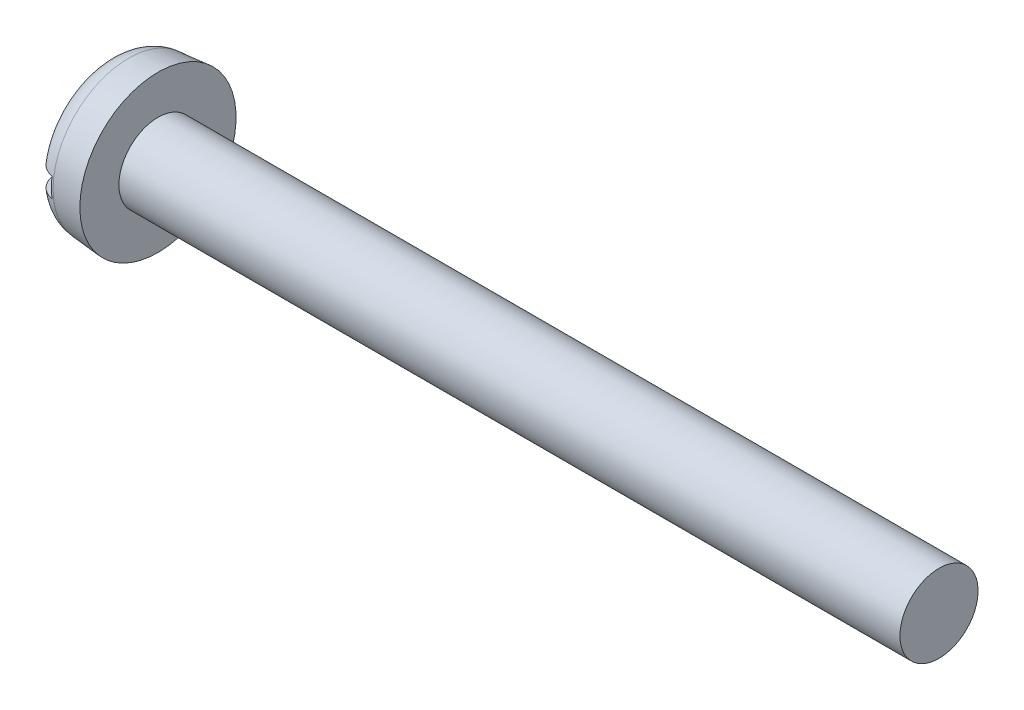
ISO-10303-21;
HEADER;
FILE_DESCRIPTION(('STEP AP214'),'2;1');
FILE_NAME('part.step','',(''),(''),'','','');
FILE_SCHEMA(('AUTOMOTIVE_DESIGN { 1 0 10303 214 1 1 1 1 }'));
ENDSEC;
DATA;
#1=APPLICATION_CONTEXT('core data for automotive mechanical design processes');
#2=APPLICATION_PROTOCOL_DEFINITION('international standard','automotive_design',2000,#1);
#3=PRODUCT_CONTEXT('',#1,'mechanical');
#4=PRODUCT('Part','Part','',(#3));
#5=PRODUCT_RELATED_PRODUCT_CATEGORY('part','',(#4));
#6=PRODUCT_DEFINITION_FORMATION('','',#4);
#7=PRODUCT_DEFINITION_CONTEXT('part definition',#1,'design');
#8=PRODUCT_DEFINITION('design','',#6,#7);
#9=PRODUCT_DEFINITION_SHAPE('','',#8);
#10=(LENGTH_UNIT() NAMED_UNIT(*) SI_UNIT(.MILLI.,.METRE.));
#11=(NAMED_UNIT(*) PLANE_ANGLE_UNIT() SI_UNIT($,.RADIAN.));
#12=(NAMED_UNIT(*) SI_UNIT($,.STERADIAN.) SOLID_ANGLE_UNIT());
#13=UNCERTAINTY_MEASURE_WITH_UNIT(LENGTH_MEASURE(1.E-05),#10,'distance_accuracy_value','');
#14=(GEOMETRIC_REPRESENTATION_CONTEXT(3) GLOBAL_UNCERTAINTY_ASSIGNED_CONTEXT((#13)) GLOBAL_UNIT_ASSIGNED_CONTEXT((#10,
#11,#12)) REPRESENTATION_CONTEXT('',''));
#15=CARTESIAN_POINT('',(0.,0.,0.));
#16=DIRECTION('',(0.,0.,1.));
#17=DIRECTION('',(1.,0.,0.));
#18=AXIS2_PLACEMENT_3D('',#15,#16,#17);
#19=CARTESIAN_POINT('',(0.,0.,0.));
#20=DIRECTION('',(-1.,0.,0.));
#21=DIRECTION('',(0.,0.,1.));
#22=AXIS2_PLACEMENT_3D('',#19,#20,#21);
#23=PLANE('',#22);
#24=DIRECTION('',(0.,0.,-1.));
#25=VECTOR('',#24,1.);
#26=CARTESIAN_POINT('',(0.,0.25,2.));
#27=LINE('',#26,#25);
#28=CARTESIAN_POINT('',(0.,0.25,1.3128752634498));
#29=VERTEX_POINT('',#28);
#30=CARTESIAN_POINT('',(0.,0.25,-1.3128752634498));
#31=VERTEX_POINT('',#30);
#32=EDGE_CURVE('E87',#29,#31,#27,.T.);
#33=ORIENTED_EDGE('',*,*,#32,.F.);
#34=CARTESIAN_POINT('',(0.,0.,0.));
#35=DIRECTION('',(-1.,0.,0.));
#36=DIRECTION('',(0.,0.,1.));
#37=AXIS2_PLACEMENT_3D('',#34,#35,#36);
#38=CIRCLE('',#37,1.33646603300584);
#39=EDGE_CURVE('E93',#29,#31,#38,.T.);
#40=ORIENTED_EDGE('',*,*,#39,.T.);
#41=EDGE_LOOP('',(#33,#40));
#42=FACE_BOUND('',#41,.T.);
#43=ADVANCED_FACE('F34',(#42),#23,.T.);
#44=CARTESIAN_POINT('',(-25.4,0.,0.));
#45=DIRECTION('',(-1.,0.,0.));
#46=DIRECTION('',(0.,0.,1.));
#47=AXIS2_PLACEMENT_3D('',#44,#45,#46);
#48=CYLINDRICAL_SURFACE('',#47,1.);
#49=CARTESIAN_POINT('',(21.3,0.,0.));
#50=DIRECTION('',(-1.,0.,0.));
#51=DIRECTION('',(0.,0.,1.));
#52=AXIS2_PLACEMENT_3D('',#49,#50,#51);
#53=CIRCLE('',#52,1.);
#54=CARTESIAN_POINT('',(21.3,0.,1.));
#55=VERTEX_POINT('',#54);
#56=EDGE_CURVE('E94',#55,#55,#53,.T.);
#57=ORIENTED_EDGE('',*,*,#56,.T.);
#58=EDGE_LOOP('',(#57));
#59=FACE_BOUND('',#58,.T.);
#60=CARTESIAN_POINT('',(1.3,0.,0.));
#61=DIRECTION('',(-1.,0.,0.));
#62=DIRECTION('',(0.,0.,1.));
#63=AXIS2_PLACEMENT_3D('',#60,#61,#62);
#64=CIRCLE('',#63,1.);
#65=CARTESIAN_POINT('',(1.3,0.,1.));
#66=VERTEX_POINT('',#65);
#67=EDGE_CURVE('E151',#66,#66,#64,.T.);
#68=ORIENTED_EDGE('',*,*,#67,.F.);
#69=EDGE_LOOP('',(#68));
#70=FACE_BOUND('',#69,.T.);
#71=ADVANCED_FACE('F139',(#59,#70),#48,.T.);
#72=CARTESIAN_POINT('',(21.3,1.,0.));
#73=DIRECTION('',(1.,0.,0.));
#74=DIRECTION('',(0.,0.,-1.));
#75=AXIS2_PLACEMENT_3D('',#72,#73,#74);
#76=PLANE('',#75);
#77=ORIENTED_EDGE('',*,*,#56,.F.);
#78=EDGE_LOOP('',(#77));
#79=FACE_BOUND('',#78,.T.);
#80=ADVANCED_FACE('F137',(#79),#76,.T.);
#81=DIRECTION('',(0.,0.,1.));
#82=VECTOR('',#81,1.);
#83=CARTESIAN_POINT('',(0.,-0.25,-2.));
#84=LINE('',#83,#82);
#85=CARTESIAN_POINT('',(0.,-0.25,-1.3128752634498));
#86=VERTEX_POINT('',#85);
#87=CARTESIAN_POINT('',(0.,-0.25,1.3128752634498));
#88=VERTEX_POINT('',#87);
#89=EDGE_CURVE('E78',#86,#88,#84,.T.);
#90=ORIENTED_EDGE('',*,*,#89,.F.);
#91=EDGE_CURVE('E85',#86,#88,#38,.T.);
#92=ORIENTED_EDGE('',*,*,#91,.T.);
#93=EDGE_LOOP('',(#90,#92));
#94=FACE_BOUND('',#93,.T.);
#95=ADVANCED_FACE('F84',(#94),#23,.T.);
#96=CARTESIAN_POINT('',(0.,0.,0.));
#97=DIRECTION('',(1.,0.,0.));
#98=DIRECTION('',(0.,0.,-1.));
#99=AXIS2_PLACEMENT_3D('',#96,#97,#98);
#100=CONICAL_SURFACE('',#99,1.8862647374163,0.0872664625997168);
#101=CARTESIAN_POINT('',(0.547706554351407,0.,0.));
#102=DIRECTION('',(-1.,0.,0.));
#103=DIRECTION('',(0.,0.,1.));
#104=AXIS2_PLACEMENT_3D('',#101,#102,#103);
#105=CIRCLE('',#104,1.93418285186089);
#106=CARTESIAN_POINT('',(0.547706554351407,0.,1.93418285186089));
#107=VERTEX_POINT('',#106);
#108=EDGE_CURVE('E97',#107,#107,#105,.F.);
#109=ORIENTED_EDGE('',*,*,#108,.T.);
#110=EDGE_LOOP('',(#109));
#111=FACE_BOUND('',#110,.T.);
#112=CARTESIAN_POINT('',(1.3,0.,0.));
#113=DIRECTION('',(-1.,0.,0.));
#114=DIRECTION('',(0.,0.,1.));
#115=AXIS2_PLACEMENT_3D('',#112,#113,#114);
#116=CIRCLE('',#115,2.);
#117=CARTESIAN_POINT('',(1.3,0.,2.));
#118=VERTEX_POINT('',#117);
#119=EDGE_CURVE('E99',#118,#118,#116,.T.);
#120=ORIENTED_EDGE('',*,*,#119,.T.);
#121=EDGE_LOOP('',(#120));
#122=FACE_BOUND('',#121,.T.);
#123=ADVANCED_FACE('F130',(#111,#122),#100,.T.);
#124=CARTESIAN_POINT('',(1.3,1.,0.));
#125=DIRECTION('',(-1.,0.,0.));
#126=DIRECTION('',(0.,0.,1.));
#127=AXIS2_PLACEMENT_3D('',#124,#125,#126);
#128=PLANE('',#127);
#129=ORIENTED_EDGE('',*,*,#119,.F.);
#130=EDGE_LOOP('',(#129));
#131=FACE_BOUND('',#130,.T.);
#132=ORIENTED_EDGE('',*,*,#67,.T.);
#133=EDGE_LOOP('',(#132));
#134=FACE_BOUND('',#133,.T.);
#135=ADVANCED_FACE('F126',(#131,#134),#128,.F.);
#136=CARTESIAN_POINT('',(0.6,0.,0.));
#137=DIRECTION('',(-1.,0.,0.));
#138=DIRECTION('',(0.,0.,1.));
#139=AXIS2_PLACEMENT_3D('',#136,#137,#138);
#140=TOROIDAL_SURFACE('',#139,1.33646603300584,0.6);
#141=CARTESIAN_POINT('',(0.274780655200361,0.25,-1.82362420667529));
#142=CARTESIAN_POINT('',(0.302850124065662,0.25,-1.84189666141675));
#143=CARTESIAN_POINT('',(0.332476912836235,0.25,-1.85782010480749));
#144=CARTESIAN_POINT('',(0.394006386294874,0.25,-1.8844828387307));
#145=CARTESIAN_POINT('',(0.425911622330593,0.25,-1.89521620967586));
#146=CARTESIAN_POINT('',(0.49106542171139,0.25,-1.91116335358415));
#147=CARTESIAN_POINT('',(0.524313546486278,0.25,-1.91637891370101));
#148=CARTESIAN_POINT('',(0.591204792683812,0.25,-1.92113959303415));
#149=CARTESIAN_POINT('',(0.624847818162146,0.25,-1.92068606223462));
#150=CARTESIAN_POINT('',(0.691513871966761,0.25,-1.91413229696864));
#151=CARTESIAN_POINT('',(0.724537965843794,0.25,-1.90804289638476));
#152=CARTESIAN_POINT('',(0.789097481854443,0.25,-1.89041111372299));
#153=CARTESIAN_POINT('',(0.820632856008674,0.25,-1.87886855602915));
#154=CARTESIAN_POINT('',(0.881355504744871,0.25,-1.85065407323916));
#155=CARTESIAN_POINT('',(0.910540461536868,0.25,-1.8339771613426));
#156=CARTESIAN_POINT('',(0.965713973197687,0.25,-1.7959832160475));
#157=CARTESIAN_POINT('',(0.991702483157432,0.25,-1.77466611746743));
#158=CARTESIAN_POINT('',(1.03989067692429,0.25,-1.72788939986325));
#159=CARTESIAN_POINT('',(1.06207077173726,0.25,-1.70240960587084));
#160=CARTESIAN_POINT('',(1.10188385808005,0.25,-1.64811708765422));
#161=CARTESIAN_POINT('',(1.11951669564412,0.25,-1.61930425062421));
#162=CARTESIAN_POINT('',(1.14991644324992,0.25,-1.55888388907361));
#163=CARTESIAN_POINT('',(1.16263701266532,0.25,-1.52725305653232));
#164=CARTESIAN_POINT('',(1.18266472006596,0.25,-1.46232290586992));
#165=CARTESIAN_POINT('',(1.18997153304379,0.25,-1.42902348770568));
#166=CARTESIAN_POINT('',(1.1990757467124,0.25,-1.36122512528321));
#167=CARTESIAN_POINT('',(1.2007978533932,0.25,-1.3267160782536));
#168=CARTESIAN_POINT('',(1.19852158611446,0.25,-1.25788795964169));
#169=CARTESIAN_POINT('',(1.19452272743365,0.25,-1.22356890440419));
#170=CARTESIAN_POINT('',(1.18084584012593,0.25,-1.15550299104831));
#171=CARTESIAN_POINT('',(1.1710768980116,0.25,-1.12177439719896));
#172=CARTESIAN_POINT('',(1.14608963326822,0.25,-1.05639845281472));
#173=CARTESIAN_POINT('',(1.13087072283895,0.25,-1.02475132721021));
#174=CARTESIAN_POINT('',(1.09517672424942,0.25,-0.964015185217591));
#175=CARTESIAN_POINT('',(1.07463585116154,0.25,-0.934964791126672));
#176=CARTESIAN_POINT('',(1.0289468611237,0.25,-0.880736843040393));
#177=CARTESIAN_POINT('',(1.00379831827947,0.25,-0.855559647447028));
#178=CARTESIAN_POINT('',(0.949690395648163,0.25,-0.809995267822458));
#179=CARTESIAN_POINT('',(0.920750663668051,0.25,-0.789584802369704));
#180=CARTESIAN_POINT('',(0.859743350231912,0.25,-0.754142685467499));
#181=CARTESIAN_POINT('',(0.827676707896818,0.25,-0.739109425347756));
#182=CARTESIAN_POINT('',(0.762667368563303,0.25,-0.715550940340569));
#183=CARTESIAN_POINT('',(0.729809776019389,0.25,-0.706791374099582));
#184=CARTESIAN_POINT('',(0.663065073704784,0.25,-0.695254567880968));
#185=CARTESIAN_POINT('',(0.629178416423444,0.25,-0.69247473610395));
#186=CARTESIAN_POINT('',(0.563211392329523,0.25,-0.693020234763517));
#187=CARTESIAN_POINT('',(0.531128042957495,0.25,-0.696037951412193));
#188=CARTESIAN_POINT('',(0.467930020079841,0.25,-0.707432616918485));
#189=CARTESIAN_POINT('',(0.436815388934093,0.25,-0.715809799789358));
#190=CARTESIAN_POINT('',(0.376446381647119,0.25,-0.737546549416802));
#191=CARTESIAN_POINT('',(0.347188974627552,0.25,-0.750897740765059));
#192=CARTESIAN_POINT('',(0.29118144985243,0.25,-0.782096393740082));
#193=CARTESIAN_POINT('',(0.264431855473699,0.25,-0.799944791073732));
#194=CARTESIAN_POINT('',(0.21280112205241,0.25,-0.840563479123866));
#195=CARTESIAN_POINT('',(0.18807630516109,0.25,-0.863532471122662));
#196=CARTESIAN_POINT('',(0.142632089074548,0.25,-0.913140155498345));
#197=CARTESIAN_POINT('',(0.121913544381091,0.25,-0.939779628685344));
#198=CARTESIAN_POINT('',(0.0841798141603359,0.25,-0.997238681509955));
#199=CARTESIAN_POINT('',(0.0673637911083437,0.25,-1.02818930073671));
#200=CARTESIAN_POINT('',(0.0390991703503447,0.25,-1.09245311591645));
#201=CARTESIAN_POINT('',(0.0276510234354346,0.25,-1.12576651002353));
#202=CARTESIAN_POINT('',(0.0103722361801808,0.25,-1.19421384118873));
#203=CARTESIAN_POINT('',(0.00460478662294662,0.25,-1.2293637757047));
#204=CARTESIAN_POINT('',(-0.000878679151094756,0.25,-1.30013265464533));
#205=CARTESIAN_POINT('',(-0.000595165424060245,0.25,-1.33575156242399));
#206=CARTESIAN_POINT('',(0.00602927957051808,0.25,-1.40603493785938));
#207=CARTESIAN_POINT('',(0.0123048116822737,0.25,-1.44070555722832));
#208=CARTESIAN_POINT('',(0.0306887868415261,0.25,-1.50847558350848));
#209=CARTESIAN_POINT('',(0.0427982176917193,0.25,-1.54157472329189));
#210=CARTESIAN_POINT('',(0.0722935157774218,0.25,-1.60468559872415));
#211=CARTESIAN_POINT('',(0.089592245738643,0.25,-1.63473812116026));
#212=CARTESIAN_POINT('',(0.129048154505429,0.25,-1.6914266708082));
#213=CARTESIAN_POINT('',(0.151198946684604,0.25,-1.71806711686356));
#214=CARTESIAN_POINT('',(0.190498702041562,0.25,-1.75782741941758));
#215=CARTESIAN_POINT('',(0.206359023192159,0.25,-1.77224346176931));
#216=CARTESIAN_POINT('',(0.23952762918078,0.25,-1.79930107726038));
#217=CARTESIAN_POINT('',(0.256835902453732,0.25,-1.81194266457048));
#218=CARTESIAN_POINT('',(0.274780655200361,0.25,-1.82362420667529));
#219=B_SPLINE_CURVE_WITH_KNOTS('',3,(#141,#142,#143,#144,#145,#146,#147,#148,#149,#150,#151,
#152,#153,#154,#155,#156,#157,#158,#159,#160,#161,#162,#163,#164,#165,#166,#167,#168,#169,#170,
#171,#172,#173,#174,#175,#176,#177,#178,#179,#180,#181,#182,#183,#184,#185,#186,#187,#188,#189,
#190,#191,#192,#193,#194,#195,#196,#197,#198,#199,#200,#201,#202,#203,#204,#205,#206,#207,#208,
#209,#210,#211,#212,#213,#214,#215,#216,#217,#218),.UNSPECIFIED.,.T.,.F.,(4,2,2,2,2,2,2,2,2,2,2,
2,2,2,2,2,2,2,2,2,2,2,2,2,2,2,2,2,2,2,2,2,2,2,2,2,2,2,4),(0.,0.100401062182578,
0.200916369230917,0.301399110583017,0.401857924372673,0.502124025494567,0.602393355851687,
0.70276038283154,0.80312881977564,0.903998978686786,1.00487255251616,1.10667574998262,
1.20848505856888,1.31166139334771,1.41484647048427,1.5197024094854,1.62456966101414,
1.73080076101002,1.83704168507411,1.94275232230141,2.04843130812937,2.14992147627128,
2.25136764660652,2.34757938832311,2.44379533127149,2.53984998938428,2.6359246495452,
2.73671855873459,2.83753394270023,2.9427139364961,3.04790276166498,3.1542488966228,
3.26058677033834,3.36577714242787,3.4709853317399,3.57451735589247,3.67791391414109,
3.74210061585798,3.8062868049523),.UNSPECIFIED.);
#220=CARTESIAN_POINT('',(0.5,0.25,-1.91179742470572));
#221=VERTEX_POINT('',#220);
#222=EDGE_CURVE('E11',#31,#221,#219,.T.);
#223=ORIENTED_EDGE('',*,*,#222,.F.);
#224=ORIENTED_EDGE('',*,*,#39,.F.);
#225=CARTESIAN_POINT('',(0.25647797126752,0.25,0.806687931408376));
#226=CARTESIAN_POINT('',(0.283073772587687,0.25,0.787245268924266));
#227=CARTESIAN_POINT('',(0.311256734673757,0.25,0.769944535846651));
#228=CARTESIAN_POINT('',(0.370114008258176,0.25,0.740229039319213));
#229=CARTESIAN_POINT('',(0.400789824440839,0.25,0.727817253657524));
#230=CARTESIAN_POINT('',(0.463871915221717,0.25,0.708374903085697));
#231=CARTESIAN_POINT('',(0.496281146765579,0.25,0.701353868838656));
#232=CARTESIAN_POINT('',(0.561820079529305,0.25,0.693064165401108));
#233=CARTESIAN_POINT('',(0.594949507008968,0.25,0.691793347727689));
#234=CARTESIAN_POINT('',(0.65986859958071,0.25,0.695008568960631));
#235=CARTESIAN_POINT('',(0.691667437306452,0.25,0.699313344775918));
#236=CARTESIAN_POINT('',(0.754098929301161,0.25,0.713169938820386));
#237=CARTESIAN_POINT('',(0.784731434429555,0.25,0.722722425688242));
#238=CARTESIAN_POINT('',(0.844220886452172,0.25,0.746760750983483));
#239=CARTESIAN_POINT('',(0.873064893626733,0.25,0.761278483323786));
#240=CARTESIAN_POINT('',(0.928072070248523,0.25,0.794719206207592));
#241=CARTESIAN_POINT('',(0.954234673131182,0.25,0.813643124999441));
#242=CARTESIAN_POINT('',(1.00455764012357,0.25,0.856403426025716));
#243=CARTESIAN_POINT('',(1.02854601727969,0.25,0.880442281861904));
#244=CARTESIAN_POINT('',(1.07233969055911,0.25,0.93206911063745));
#245=CARTESIAN_POINT('',(1.09214414470062,0.25,0.959657796158255));
#246=CARTESIAN_POINT('',(1.1277806057224,0.25,1.01880991735135));
#247=CARTESIAN_POINT('',(1.14342273788476,0.25,1.05048797462787));
#248=CARTESIAN_POINT('',(1.16921417457241,0.25,1.11600811372881));
#249=CARTESIAN_POINT('',(1.17936312023956,0.25,1.14985033677212));
#250=CARTESIAN_POINT('',(1.19390640883483,0.25,1.21901855241697));
#251=CARTESIAN_POINT('',(1.198256990977,0.25,1.25435377468586));
#252=CARTESIAN_POINT('',(1.20088701701162,0.25,1.32525082928571));
#253=CARTESIAN_POINT('',(1.19916675302153,0.25,1.36081265063096));
#254=CARTESIAN_POINT('',(1.18971168250471,0.25,1.43069187166979));
#255=CARTESIAN_POINT('',(1.18204966947663,0.25,1.46501910735442));
#256=CARTESIAN_POINT('',(1.16097413489613,0.25,1.53186104297244));
#257=CARTESIAN_POINT('',(1.14756110125118,0.25,1.5643758964011));
#258=CARTESIAN_POINT('',(1.11560510746244,0.25,1.62610187095566));
#259=CARTESIAN_POINT('',(1.097149951566,0.25,1.65535845455428));
#260=CARTESIAN_POINT('',(1.05552533497899,0.25,1.71030063892362));
#261=CARTESIAN_POINT('',(1.03235623843943,0.25,1.73598651527295));
#262=CARTESIAN_POINT('',(0.982310027591305,0.25,1.78268807238429));
#263=CARTESIAN_POINT('',(0.955488368089889,0.25,1.80376319341113));
#264=CARTESIAN_POINT('',(0.898659765129522,0.25,1.8410604546949));
#265=CARTESIAN_POINT('',(0.868652997996469,0.25,1.85728286340582));
#266=CARTESIAN_POINT('',(0.806611342278962,0.25,1.88426128245479));
#267=CARTESIAN_POINT('',(0.774598152543608,0.25,1.89506720989169));
#268=CARTESIAN_POINT('',(0.709207275735754,0.25,1.91112053581599));
#269=CARTESIAN_POINT('',(0.67582963400342,0.25,1.91636811884914));
#270=CARTESIAN_POINT('',(0.608837656027687,0.25,1.92113717337632));
#271=CARTESIAN_POINT('',(0.575225363311112,0.25,1.92068739829934));
#272=CARTESIAN_POINT('',(0.508554909070377,0.25,1.91414489858889));
#273=CARTESIAN_POINT('',(0.475496740593514,0.25,1.90805224481175));
#274=CARTESIAN_POINT('',(0.410905076842549,0.25,1.89041194259857));
#275=CARTESIAN_POINT('',(0.379370111612107,0.25,1.87886967409414));
#276=CARTESIAN_POINT('',(0.318677746934266,0.25,1.85066978427311));
#277=CARTESIAN_POINT('',(0.289520360090016,0.25,1.83401213584294));
#278=CARTESIAN_POINT('',(0.234312878154215,0.25,1.79600861494103));
#279=CARTESIAN_POINT('',(0.20827228119735,0.25,1.77464894819558));
#280=CARTESIAN_POINT('',(0.160116194508203,0.25,1.72788872147726));
#281=CARTESIAN_POINT('',(0.13800080840638,0.25,1.70248805485052));
#282=CARTESIAN_POINT('',(0.0981483460954305,0.25,1.64818018628309));
#283=CARTESIAN_POINT('',(0.0804433545930309,0.25,1.61924944626991));
#284=CARTESIAN_POINT('',(0.0500800334875073,0.25,1.55885213954979));
#285=CARTESIAN_POINT('',(0.0374219573508648,0.25,1.52738544557741));
#286=CARTESIAN_POINT('',(0.0173499908938403,0.25,1.46242951274809));
#287=CARTESIAN_POINT('',(0.00999744820991976,0.25,1.42892132543473));
#288=CARTESIAN_POINT('',(0.000932027792608534,0.25,1.36115298475673));
#289=CARTESIAN_POINT('',(-0.000780662751594845,0.25,1.32689280647116));
#290=CARTESIAN_POINT('',(0.00145026647964888,0.25,1.25804055944597));
#291=CARTESIAN_POINT('',(0.00547954732126168,0.25,1.22345127364072));
#292=CARTESIAN_POINT('',(0.0191955913899645,0.25,1.15540432623591));
#293=CARTESIAN_POINT('',(0.0288841889000252,0.25,1.12194703525683));
#294=CARTESIAN_POINT('',(0.0538243357846501,0.25,1.05655247440412));
#295=CARTESIAN_POINT('',(0.0691636585180377,0.25,1.02464870679869));
#296=CARTESIAN_POINT('',(0.104937128864068,0.25,0.963866007236644));
#297=CARTESIAN_POINT('',(0.125366421619971,0.25,0.934984229941663));
#298=CARTESIAN_POINT('',(0.164028944144066,0.25,0.889058344229296));
#299=CARTESIAN_POINT('',(0.181121312132095,0.25,0.87104130385289));
#300=CARTESIAN_POINT('',(0.217335307543651,0.25,0.837174222613301));
#301=CARTESIAN_POINT('',(0.236456923370607,0.25,0.821324169367588));
#302=CARTESIAN_POINT('',(0.25647797126752,0.25,0.806687931408376));
#303=B_SPLINE_CURVE_WITH_KNOTS('',3,(#225,#226,#227,#228,#229,#230,#231,#232,#233,#234,#235,
#236,#237,#238,#239,#240,#241,#242,#243,#244,#245,#246,#247,#248,#249,#250,#251,#252,#253,#254,
#255,#256,#257,#258,#259,#260,#261,#262,#263,#264,#265,#266,#267,#268,#269,#270,#271,#272,#273,
#274,#275,#276,#277,#278,#279,#280,#281,#282,#283,#284,#285,#286,#287,#288,#289,#290,#291,#292,
#293,#294,#295,#296,#297,#298,#299,#300,#301,#302),.UNSPECIFIED.,.T.,.F.,(4,2,2,2,2,2,2,2,2,2,2,
2,2,2,2,2,2,2,2,2,2,2,2,2,2,2,2,2,2,2,2,2,2,2,2,2,2,2,4),(0.,0.0987501477700194,
0.19756035018262,0.296544845923676,0.39549235452428,0.491302394396121,0.587124644765227,
0.68357433728144,0.780044367203688,0.881471955879884,0.9829199366625,1.08841286316154,
1.19391268045661,1.30020428911123,1.40649078328765,1.51149532344498,1.61649095694569,
1.71976342015201,1.82302790860739,1.92487039176505,2.02670723991341,2.12758748528433,
2.22846438116773,2.32883237519779,2.42919910894713,2.52946696584731,2.62973535421627,
2.73030191514127,2.83087113075401,2.93215189853696,3.03343775220811,3.13587677944123,
3.23831920663671,3.34230600671742,3.44632652944514,3.5520360732953,3.65764517390562,
3.73198370247418,3.80632180624214),.UNSPECIFIED.);
#304=CARTESIAN_POINT('',(0.5,0.25,1.91179742470572));
#305=VERTEX_POINT('',#304);
#306=EDGE_CURVE('E111',#305,#29,#303,.T.);
#307=ORIENTED_EDGE('',*,*,#306,.F.);
#308=CARTESIAN_POINT('',(0.5,0.,0.));
#309=DIRECTION('',(-1.,0.,0.));
#310=DIRECTION('',(0.,0.,1.));
#311=AXIS2_PLACEMENT_3D('',#308,#309,#310);
#312=CIRCLE('',#311,1.92807401131581);
#313=CARTESIAN_POINT('',(0.5,-0.25,1.91179742470572));
#314=VERTEX_POINT('',#313);
#315=EDGE_CURVE('E105',#305,#314,#312,.F.);
#316=ORIENTED_EDGE('',*,*,#315,.T.);
#317=CARTESIAN_POINT('',(0.25647797126752,-0.25,0.806687931408376));
#318=CARTESIAN_POINT('',(0.22811461508231,-0.25,0.827425620219486));
#319=CARTESIAN_POINT('',(0.201516055297732,-0.25,0.850630894293789));
#320=CARTESIAN_POINT('',(0.152571331977692,-0.25,0.901208782716564));
#321=CARTESIAN_POINT('',(0.130232677758372,-0.25,0.928588605834286));
#322=CARTESIAN_POINT('',(0.0904534192406148,-0.25,0.986651718459008));
#323=CARTESIAN_POINT('',(0.0730064503192135,-0.25,1.0173306428444));
#324=CARTESIAN_POINT('',(0.043460232946248,-0.25,1.08114792064194));
#325=CARTESIAN_POINT('',(0.0313588569417123,-0.25,1.11428528944574));
#326=CARTESIAN_POINT('',(0.0127636490885255,-0.25,1.1824429151294));
#327=CARTESIAN_POINT('',(0.00632467814466838,-0.25,1.21747817526152));
#328=CARTESIAN_POINT('',(-0.000517283901222732,-0.25,1.28813764188796));
#329=CARTESIAN_POINT('',(-0.000920002337641562,-0.25,1.3237618749142));
#330=CARTESIAN_POINT('',(0.00434800778750714,-0.25,1.39420239184286));
#331=CARTESIAN_POINT('',(0.00995817056286334,-0.25,1.42902319077614));
#332=CARTESIAN_POINT('',(0.0270441493196888,-0.25,1.49719541380208));
#333=CARTESIAN_POINT('',(0.0385194335615698,-0.25,1.53054697080046));
#334=CARTESIAN_POINT('',(0.0668053333263151,-0.25,1.59425150405687));
#335=CARTESIAN_POINT('',(0.0835255252196934,-0.25,1.62464463268788));
#336=CARTESIAN_POINT('',(0.121902514595008,-0.25,1.6821361772215));
#337=CARTESIAN_POINT('',(0.143558907828022,-0.25,1.70923486264318));
#338=CARTESIAN_POINT('',(0.190851277951756,-0.25,1.75895715118281));
#339=CARTESIAN_POINT('',(0.216425242565036,-0.25,1.78163974924995));
#340=CARTESIAN_POINT('',(0.271051715066319,-0.25,1.82233619463279));
#341=CARTESIAN_POINT('',(0.300104021127431,-0.25,1.84035031264008));
#342=CARTESIAN_POINT('',(0.360541640657975,-0.25,1.87101228101318));
#343=CARTESIAN_POINT('',(0.391900202395491,-0.25,1.88371287767629));
#344=CARTESIAN_POINT('',(0.456312001468162,-0.25,1.90363448924139));
#345=CARTESIAN_POINT('',(0.489365175345782,-0.25,1.91085570916788));
#346=CARTESIAN_POINT('',(0.556022772858472,-0.25,1.91957878374415));
#347=CARTESIAN_POINT('',(0.589622905521806,-0.25,1.92111345806165));
#348=CARTESIAN_POINT('',(0.656602284044621,-0.25,1.91850953421242));
#349=CARTESIAN_POINT('',(0.689981533445374,-0.25,1.9143710272225));
#350=CARTESIAN_POINT('',(0.755513913993921,-0.25,1.9005544490505));
#351=CARTESIAN_POINT('',(0.787669009716197,-0.25,1.89088569056007));
#352=CARTESIAN_POINT('',(0.849904715559474,-0.25,1.86629884137169));
#353=CARTESIAN_POINT('',(0.879985320055665,-0.25,1.85138073644125));
#354=CARTESIAN_POINT('',(0.937296248504193,-0.25,1.81668982088819));
#355=CARTESIAN_POINT('',(0.964519921503605,-0.25,1.79690602558855));
#356=CARTESIAN_POINT('',(1.01528516641715,-0.25,1.75307523190286));
#357=CARTESIAN_POINT('',(1.03882665732028,-0.25,1.72902813974565));
#358=CARTESIAN_POINT('',(1.08172595916947,-0.25,1.67719606185349));
#359=CARTESIAN_POINT('',(1.10105627962252,-0.25,1.64938832937458));
#360=CARTESIAN_POINT('',(1.13482995867941,-0.25,1.5909499281355));
#361=CARTESIAN_POINT('',(1.1492731095708,-0.25,1.56031913946136));
#362=CARTESIAN_POINT('',(1.17303442993066,-0.25,1.49675978182125));
#363=CARTESIAN_POINT('',(1.18229654757927,-0.25,1.46381026645167));
#364=CARTESIAN_POINT('',(1.19524406921989,-0.25,1.39683436474365));
#365=CARTESIAN_POINT('',(1.19892909236176,-0.25,1.36280790502451));
#366=CARTESIAN_POINT('',(1.2006801090878,-0.25,1.29411335821481));
#367=CARTESIAN_POINT('',(1.19866316593094,-0.25,1.25944316342795));
#368=CARTESIAN_POINT('',(1.18893397437426,-0.25,1.19091174344461));
#369=CARTESIAN_POINT('',(1.18122120940792,-0.25,1.15705059190959));
#370=CARTESIAN_POINT('',(1.1601769908767,-0.25,1.09051812196973));
#371=CARTESIAN_POINT('',(1.14675676173025,-0.25,1.05787487044025));
#372=CARTESIAN_POINT('',(1.11467775754884,-0.25,0.995269036554544));
#373=CARTESIAN_POINT('',(1.09601835733878,-0.25,0.965306774676047));
#374=CARTESIAN_POINT('',(1.05376852779922,-0.25,0.908648094512249));
#375=CARTESIAN_POINT('',(1.03013402245569,-0.25,0.881984499365601));
#376=CARTESIAN_POINT('',(0.978662413228472,-0.25,0.833068820610378));
#377=CARTESIAN_POINT('',(0.950825230537788,-0.25,0.810816819744432));
#378=CARTESIAN_POINT('',(0.892141273449015,-0.25,0.771800498870371));
#379=CARTESIAN_POINT('',(0.861346635725293,-0.25,0.754957957909245));
#380=CARTESIAN_POINT('',(0.797264463313657,-0.25,0.726991035263802));
#381=CARTESIAN_POINT('',(0.763978152414699,-0.25,0.715863867305707));
#382=CARTESIAN_POINT('',(0.697614354203181,-0.25,0.700248790529691));
#383=CARTESIAN_POINT('',(0.66460756742684,-0.25,0.69546044216975));
#384=CARTESIAN_POINT('',(0.598260395579763,-0.25,0.691762050694227));
#385=CARTESIAN_POINT('',(0.564920014690449,-0.25,0.692851933990089));
#386=CARTESIAN_POINT('',(0.500305713906346,-0.25,0.700686922928174));
#387=CARTESIAN_POINT('',(0.46900300241209,-0.25,0.707199303446527));
#388=CARTESIAN_POINT('',(0.407926960128377,-0.25,0.725286338726901));
#389=CARTESIAN_POINT('',(0.378151979755174,-0.25,0.736855399235375));
#390=CARTESIAN_POINT('',(0.333202955789929,-0.25,0.75861828709463));
#391=CARTESIAN_POINT('',(0.317258156054092,-0.25,0.767262590798233));
#392=CARTESIAN_POINT('',(0.286211704034722,-0.25,0.785948392377952));
#393=CARTESIAN_POINT('',(0.271110004852099,-0.25,0.795989812428051));
#394=CARTESIAN_POINT('',(0.25647797126752,-0.25,0.806687931408376));
#395=B_SPLINE_CURVE_WITH_KNOTS('',3,(#317,#318,#319,#320,#321,#322,#323,#324,#325,#326,#327,
#328,#329,#330,#331,#332,#333,#334,#335,#336,#337,#338,#339,#340,#341,#342,#343,#344,#345,#346,
#347,#348,#349,#350,#351,#352,#353,#354,#355,#356,#357,#358,#359,#360,#361,#362,#363,#364,#365,
#366,#367,#368,#369,#370,#371,#372,#373,#374,#375,#376,#377,#378,#379,#380,#381,#382,#383,#384,
#385,#386,#387,#388,#389,#390,#391,#392,#393,#394),.UNSPECIFIED.,.T.,.F.,(4,2,2,2,2,2,2,2,2,2,2,
2,2,2,2,2,2,2,2,2,2,2,2,2,2,2,2,2,2,2,2,2,2,2,2,2,2,2,4),(0.,0.105339517541497,
0.210863043847173,0.316248628408819,0.421592231495568,0.527945567697215,0.634303708007108,
0.739600518645185,0.8448877846295,0.948451329469218,1.05200639604478,1.1540654205465,
1.25611852605422,1.35713304654448,1.45814378713888,1.55857063213837,1.65899586314173,
1.75925247843266,1.85950936555035,1.95999470219394,2.06048224928579,2.16160732902587,
2.2627367062024,2.36493999460764,2.46715026198412,2.57085482340577,2.67456879117567,
2.77995861689427,2.88536102382396,2.9917397945569,3.09812056031159,3.20288545926039,
3.30759923619073,3.40714743935949,3.50669439630456,3.60217675632204,3.69755374960456,
3.75189912320181,3.80624147071477),.UNSPECIFIED.);
#396=EDGE_CURVE('E92',#88,#314,#395,.T.);
#397=ORIENTED_EDGE('',*,*,#396,.F.);
#398=ORIENTED_EDGE('',*,*,#91,.F.);
#399=CARTESIAN_POINT('',(0.274780655200361,-0.25,-1.82362420667529));
#400=CARTESIAN_POINT('',(0.246412102452132,-0.25,-1.80515338183894));
#401=CARTESIAN_POINT('',(0.21959244724356,-0.25,-1.78425531890811));
#402=CARTESIAN_POINT('',(0.169833030497775,-0.25,-1.73822266295481));
#403=CARTESIAN_POINT('',(0.146898387228132,-0.25,-1.71308256697065));
#404=CARTESIAN_POINT('',(0.105585790103501,-0.25,-1.6593372656025));
#405=CARTESIAN_POINT('',(0.0872036369512325,-0.25,-1.6307352900536));
#406=CARTESIAN_POINT('',(0.0554631702647639,-0.25,-1.57088061633069));
#407=CARTESIAN_POINT('',(0.0421035983782343,-0.25,-1.539628584507));
#408=CARTESIAN_POINT('',(0.0206432771902915,-0.25,-1.47507749615836));
#409=CARTESIAN_POINT('',(0.0125876254984659,-0.25,-1.44176345508561));
#410=CARTESIAN_POINT('',(0.00209404371654316,-0.25,-1.37426177356359));
#411=CARTESIAN_POINT('',(-0.000343263952376172,-0.25,-1.34007403674719));
#412=CARTESIAN_POINT('',(0.000426825088754777,-0.25,-1.27125045227628));
#413=CARTESIAN_POINT('',(0.00371931456959635,-0.25,-1.23661556247096));
#414=CARTESIAN_POINT('',(0.0159771202394858,-0.25,-1.16836487965491));
#415=CARTESIAN_POINT('',(0.0249429593885403,-0.25,-1.1347491808909));
#416=CARTESIAN_POINT('',(0.0484576079098379,-0.25,-1.06892310437898));
#417=CARTESIAN_POINT('',(0.0630932921348849,-0.25,-1.03674374367566));
#418=CARTESIAN_POINT('',(0.0975178908169313,-0.25,-0.975266378936166));
#419=CARTESIAN_POINT('',(0.117307414846903,-0.25,-0.945968716299347));
#420=CARTESIAN_POINT('',(0.161678775070649,-0.25,-0.890885916345782));
#421=CARTESIAN_POINT('',(0.186295749588469,-0.25,-0.865129042953098));
#422=CARTESIAN_POINT('',(0.239578542918412,-0.25,-0.81820190376519));
#423=CARTESIAN_POINT('',(0.268244266621965,-0.25,-0.797031530258765));
#424=CARTESIAN_POINT('',(0.32827251951993,-0.25,-0.76039601809818));
#425=CARTESIAN_POINT('',(0.359573150112362,-0.25,-0.744829720355555));
#426=CARTESIAN_POINT('',(0.424438831887223,-0.25,-0.719501501346933));
#427=CARTESIAN_POINT('',(0.458002805134312,-0.25,-0.709736838442931));
#428=CARTESIAN_POINT('',(0.524586152437568,-0.25,-0.696826910772117));
#429=CARTESIAN_POINT('',(0.557544486769873,-0.25,-0.693366517126951));
#430=CARTESIAN_POINT('',(0.623554751672406,-0.25,-0.692262369608287));
#431=CARTESIAN_POINT('',(0.656606659486082,-0.25,-0.694617305616992));
#432=CARTESIAN_POINT('',(0.720611933799709,-0.25,-0.704833460708912));
#433=CARTESIAN_POINT('',(0.751597966403628,-0.25,-0.712492488093248));
#434=CARTESIAN_POINT('',(0.811898810445142,-0.25,-0.732772492269664));
#435=CARTESIAN_POINT('',(0.841213363360532,-0.25,-0.745394234257513));
#436=CARTESIAN_POINT('',(0.898189202124164,-0.25,-0.775523337991995));
#437=CARTESIAN_POINT('',(0.925787684286251,-0.25,-0.793149196355938));
#438=CARTESIAN_POINT('',(0.977832434568893,-0.25,-0.83256115323777));
#439=CARTESIAN_POINT('',(1.0022779916631,-0.25,-0.854348187417305));
#440=CARTESIAN_POINT('',(1.04866939922734,-0.25,-0.902723861616108));
#441=CARTESIAN_POINT('',(1.07041372154462,-0.25,-0.929505970910612));
#442=CARTESIAN_POINT('',(1.10925507245311,-0.25,-0.986252581526152));
#443=CARTESIAN_POINT('',(1.12635132905473,-0.25,-1.01621761034511));
#444=CARTESIAN_POINT('',(1.15587826370585,-0.25,-1.07945315539287));
#445=CARTESIAN_POINT('',(1.16815613299896,-0.25,-1.11279518659324));
#446=CARTESIAN_POINT('',(1.18693723838892,-0.25,-1.18106947273944));
#447=CARTESIAN_POINT('',(1.1934403543256,-0.25,-1.2160017607592));
#448=CARTESIAN_POINT('',(1.20044092616513,-0.25,-1.28644113223491));
#449=CARTESIAN_POINT('',(1.20094258611858,-0.25,-1.32194779587657));
#450=CARTESIAN_POINT('',(1.19588430233747,-0.25,-1.39252791212313));
#451=CARTESIAN_POINT('',(1.19032476970293,-0.25,-1.42760139394538));
#452=CARTESIAN_POINT('',(1.17338401955317,-0.25,-1.49576581682077));
#453=CARTESIAN_POINT('',(1.16208963405868,-0.25,-1.52887833044069));
#454=CARTESIAN_POINT('',(1.13401256129969,-0.25,-1.59268937671454));
#455=CARTESIAN_POINT('',(1.11723033304274,-0.25,-1.62338811099263));
#456=CARTESIAN_POINT('',(1.07894820628702,-0.25,-1.6809798631895));
#457=CARTESIAN_POINT('',(1.05752802949783,-0.25,-1.70792588292094));
#458=CARTESIAN_POINT('',(1.01041587459132,-0.25,-1.75778184073562));
#459=CARTESIAN_POINT('',(0.984724190633808,-0.25,-1.78069205652324));
#460=CARTESIAN_POINT('',(0.930145997257693,-0.25,-1.82153088343964));
#461=CARTESIAN_POINT('',(0.901303114330234,-0.25,-1.83951781323057));
#462=CARTESIAN_POINT('',(0.840989444753482,-0.25,-1.87034790500803));
#463=CARTESIAN_POINT('',(0.80951889152929,-0.25,-1.88319152330656));
#464=CARTESIAN_POINT('',(0.745117220679505,-0.25,-1.90327101630393));
#465=CARTESIAN_POINT('',(0.712199973113327,-0.25,-1.91055140172039));
#466=CARTESIAN_POINT('',(0.645600086806313,-0.25,-1.91946097417425));
#467=CARTESIAN_POINT('',(0.611917272957429,-0.25,-1.92108885495024));
#468=CARTESIAN_POINT('',(0.544871876047508,-0.25,-1.91864749728835));
#469=CARTESIAN_POINT('',(0.511508609397815,-0.25,-1.91459667979622));
#470=CARTESIAN_POINT('',(0.445965972419364,-0.25,-1.90095089068297));
#471=CARTESIAN_POINT('',(0.413785173235376,-0.25,-1.89136286121127));
#472=CARTESIAN_POINT('',(0.363791372711458,-0.25,-1.87176511786162));
#473=CARTESIAN_POINT('',(0.345312453158674,-0.25,-1.86340950174437));
#474=CARTESIAN_POINT('',(0.309297583953017,-0.25,-1.84486721881352));
#475=CARTESIAN_POINT('',(0.291761631921714,-0.25,-1.83468055661862));
#476=CARTESIAN_POINT('',(0.274780655200361,-0.25,-1.82362420667529));
#477=B_SPLINE_CURVE_WITH_KNOTS('',3,(#399,#400,#401,#402,#403,#404,#405,#406,#407,#408,#409,
#410,#411,#412,#413,#414,#415,#416,#417,#418,#419,#420,#421,#422,#423,#424,#425,#426,#427,#428,
#429,#430,#431,#432,#433,#434,#435,#436,#437,#438,#439,#440,#441,#442,#443,#444,#445,#446,#447,
#448,#449,#450,#451,#452,#453,#454,#455,#456,#457,#458,#459,#460,#461,#462,#463,#464,#465,#466,
#467,#468,#469,#470,#471,#472,#473,#474,#475,#476),.UNSPECIFIED.,.T.,.F.,(4,2,2,2,2,2,2,2,2,2,2,
2,2,2,2,2,2,2,2,2,2,2,2,2,2,2,2,2,2,2,2,2,2,2,2,2,2,2,4),(0.,0.101480580506103,
0.203093832917957,0.304613003415434,0.406106722427987,0.50845263418779,0.610809883665933,
0.71470023289865,0.818600159967562,0.924159397786761,1.02973112635202,1.13610190501634,
1.24247018535583,1.34680873724124,1.45109794328897,1.55001387342549,1.64890752112834,
1.74422508190664,1.83955734536687,1.93736831081816,2.0352012955127,2.13822665399301,
2.24126911334704,2.34735670277911,2.45344649961387,2.55946197564848,2.66547026163701,
2.76991930669343,2.87435961778195,2.97713002210324,3.07989335201045,3.18138079965786,
3.28285924139421,3.38351701076899,3.48419804002939,3.58455322803929,3.68478287038869,
3.74552772886801,3.80627243412447),.UNSPECIFIED.);
#478=CARTESIAN_POINT('',(0.5,-0.25,-1.91179742470572));
#479=VERTEX_POINT('',#478);
#480=EDGE_CURVE('E46',#479,#86,#477,.T.);
#481=ORIENTED_EDGE('',*,*,#480,.F.);
#482=EDGE_CURVE('E58',#479,#221,#312,.F.);
#483=ORIENTED_EDGE('',*,*,#482,.T.);
#484=EDGE_LOOP('',(#223,#224,#307,#316,#397,#398,#481,#483));
#485=FACE_BOUND('',#484,.T.);
#486=ORIENTED_EDGE('',*,*,#108,.F.);
#487=EDGE_LOOP('',(#486));
#488=FACE_BOUND('',#487,.T.);
#489=ADVANCED_FACE('F36',(#485,#488),#140,.T.);
#490=CARTESIAN_POINT('',(0.5,0.25,2.));
#491=DIRECTION('',(0.,1.,0.));
#492=DIRECTION('',(0.,0.,1.));
#493=AXIS2_PLACEMENT_3D('',#490,#491,#492);
#494=PLANE('',#493);
#495=ORIENTED_EDGE('',*,*,#222,.T.);
#496=DIRECTION('',(0.,0.,-1.));
#497=VECTOR('',#496,1.);
#498=CARTESIAN_POINT('',(0.5,0.25,2.));
#499=LINE('',#498,#497);
#500=EDGE_CURVE('E86',#305,#221,#499,.T.);
#501=ORIENTED_EDGE('',*,*,#500,.F.);
#502=ORIENTED_EDGE('',*,*,#306,.T.);
#503=ORIENTED_EDGE('',*,*,#32,.T.);
#504=EDGE_LOOP('',(#495,#501,#502,#503));
#505=FACE_BOUND('',#504,.T.);
#506=ADVANCED_FACE('F118',(#505),#494,.F.);
#507=CARTESIAN_POINT('',(0.5,-0.25,-2.));
#508=DIRECTION('',(0.,-1.,0.));
#509=DIRECTION('',(0.,0.,-1.));
#510=AXIS2_PLACEMENT_3D('',#507,#508,#509);
#511=PLANE('',#510);
#512=ORIENTED_EDGE('',*,*,#480,.T.);
#513=ORIENTED_EDGE('',*,*,#89,.T.);
#514=ORIENTED_EDGE('',*,*,#396,.T.);
#515=DIRECTION('',(0.,0.,1.));
#516=VECTOR('',#515,1.);
#517=CARTESIAN_POINT('',(0.5,-0.25,-2.));
#518=LINE('',#517,#516);
#519=EDGE_CURVE('E53',#479,#314,#518,.T.);
#520=ORIENTED_EDGE('',*,*,#519,.F.);
#521=EDGE_LOOP('',(#512,#513,#514,#520));
#522=FACE_BOUND('',#521,.T.);
#523=ADVANCED_FACE('F77',(#522),#511,.F.);
#524=CARTESIAN_POINT('',(0.5,0.25,-2.));
#525=DIRECTION('',(-1.,0.,0.));
#526=DIRECTION('',(0.,0.,1.));
#527=AXIS2_PLACEMENT_3D('',#524,#525,#526);
#528=PLANE('',#527);
#529=ORIENTED_EDGE('',*,*,#519,.T.);
#530=ORIENTED_EDGE('',*,*,#315,.F.);
#531=ORIENTED_EDGE('',*,*,#500,.T.);
#532=ORIENTED_EDGE('',*,*,#482,.F.);
#533=EDGE_LOOP('',(#529,#530,#531,#532));
#534=FACE_BOUND('',#533,.T.);
#535=ADVANCED_FACE('F117',(#534),#528,.T.);
#536=CLOSED_SHELL('',(#43,#71,#80,#95,#123,#135,#489,#506,#523,#535));
#537=MANIFOLD_SOLID_BREP('B2',#536);
#538=ADVANCED_BREP_SHAPE_REPRESENTATION('',(#18,#537),#14);
#539=SHAPE_DEFINITION_REPRESENTATION(#9,#538);
ENDSEC;
END-ISO-10303-21;
